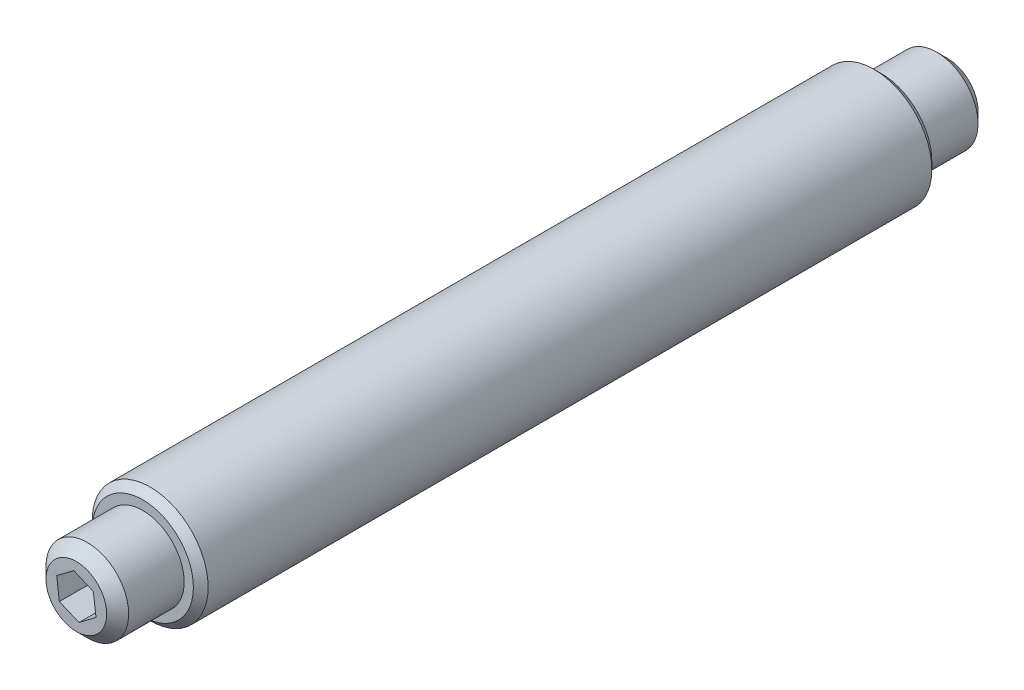
ISO-10303-21;
HEADER;
FILE_DESCRIPTION(('STEP AP214'),'2;1');
FILE_NAME('part.step','',(''),(''),'','','');
FILE_SCHEMA(('AUTOMOTIVE_DESIGN { 1 0 10303 214 1 1 1 1 }'));
ENDSEC;
DATA;
#1=APPLICATION_CONTEXT('core data for automotive mechanical design processes');
#2=APPLICATION_PROTOCOL_DEFINITION('international standard','automotive_design',2000,#1);
#3=PRODUCT_CONTEXT('',#1,'mechanical');
#4=PRODUCT('Part','Part','',(#3));
#5=PRODUCT_RELATED_PRODUCT_CATEGORY('part','',(#4));
#6=PRODUCT_DEFINITION_FORMATION('','',#4);
#7=PRODUCT_DEFINITION_CONTEXT('part definition',#1,'design');
#8=PRODUCT_DEFINITION('design','',#6,#7);
#9=PRODUCT_DEFINITION_SHAPE('','',#8);
#10=(LENGTH_UNIT() NAMED_UNIT(*) SI_UNIT(.MILLI.,.METRE.));
#11=(NAMED_UNIT(*) PLANE_ANGLE_UNIT() SI_UNIT($,.RADIAN.));
#12=(NAMED_UNIT(*) SI_UNIT($,.STERADIAN.) SOLID_ANGLE_UNIT());
#13=UNCERTAINTY_MEASURE_WITH_UNIT(LENGTH_MEASURE(1.E-05),#10,'distance_accuracy_value','');
#14=(GEOMETRIC_REPRESENTATION_CONTEXT(3) GLOBAL_UNCERTAINTY_ASSIGNED_CONTEXT((#13)) GLOBAL_UNIT_ASSIGNED_CONTEXT((#10,
#11,#12)) REPRESENTATION_CONTEXT('',''));
#15=CARTESIAN_POINT('',(0.,0.,0.));
#16=DIRECTION('',(0.,0.,1.));
#17=DIRECTION('',(1.,0.,0.));
#18=AXIS2_PLACEMENT_3D('',#15,#16,#17);
#19=CARTESIAN_POINT('',(0.,0.,14.986));
#20=DIRECTION('',(0.,0.,1.));
#21=DIRECTION('',(0.797255009832151,0.603642650330092,0.));
#22=AXIS2_PLACEMENT_3D('',#19,#20,#21);
#23=PLANE('',#22);
#24=CARTESIAN_POINT('',(0.,0.,14.986));
#25=DIRECTION('',(0.,0.,1.));
#26=DIRECTION('',(0.797255009832151,0.603642650330092,0.));
#27=AXIS2_PLACEMENT_3D('',#24,#25,#26);
#28=CIRCLE('',#27,1.04394);
#29=CARTESIAN_POINT('',(0.832286394964176,0.630166708385596,14.986));
#30=VERTEX_POINT('',#29);
#31=EDGE_CURVE('P0_E10',#30,#30,#28,.T.);
#32=ORIENTED_EDGE('',*,*,#31,.T.);
#33=EDGE_LOOP('',(#32));
#34=FACE_BOUND('',#33,.T.);
#35=DIRECTION('',(-0.79725500983215,-0.603642650330092,0.));
#36=VECTOR('',#35,1.);
#37=CARTESIAN_POINT('',(-0.0910255074271106,0.727562842874054,14.986));
#38=LINE('',#37,#36);
#39=CARTESIAN_POINT('',(-0.0910255074271106,0.727562842874054,14.986));
#40=VERTEX_POINT('',#39);
#41=CARTESIAN_POINT('',(-0.67560065849211,0.284951019612783,14.986));
#42=VERTEX_POINT('',#41);
#43=EDGE_CURVE('P0_E77',#40,#42,#38,.T.);
#44=ORIENTED_EDGE('',*,*,#43,.F.);
#45=DIRECTION('',(0.921397374909702,-0.388621766644009,0.));
#46=VECTOR('',#45,1.);
#47=CARTESIAN_POINT('',(-0.0910255074271106,0.727562842874054,14.986));
#48=LINE('',#47,#46);
#49=CARTESIAN_POINT('',(0.584575151064998,0.442611823261273,14.986));
#50=VERTEX_POINT('',#49);
#51=EDGE_CURVE('P0_E30',#40,#50,#48,.T.);
#52=ORIENTED_EDGE('',*,*,#51,.T.);
#53=DIRECTION('',(-0.124142365077551,0.992264416974101,0.));
#54=VECTOR('',#53,1.);
#55=CARTESIAN_POINT('',(0.675600658492106,-0.284951019612777,14.986));
#56=LINE('',#55,#54);
#57=CARTESIAN_POINT('',(0.675600658492106,-0.284951019612777,14.986));
#58=VERTEX_POINT('',#57);
#59=EDGE_CURVE('P0_E83',#58,#50,#56,.T.);
#60=ORIENTED_EDGE('',*,*,#59,.F.);
#61=DIRECTION('',(-0.797255009832151,-0.603642650330092,0.));
#62=VECTOR('',#61,1.);
#63=CARTESIAN_POINT('',(0.675600658492106,-0.284951019612777,14.986));
#64=LINE('',#63,#62);
#65=CARTESIAN_POINT('',(0.0910255074271064,-0.727562842874048,14.986));
#66=VERTEX_POINT('',#65);
#67=EDGE_CURVE('P0_E103',#58,#66,#64,.T.);
#68=ORIENTED_EDGE('',*,*,#67,.T.);
#69=DIRECTION('',(-0.921397374909702,0.388621766644009,0.));
#70=VECTOR('',#69,1.);
#71=CARTESIAN_POINT('',(0.0910255074271064,-0.727562842874048,14.986));
#72=LINE('',#71,#70);
#73=CARTESIAN_POINT('',(-0.584575151065002,-0.442611823261268,14.986));
#74=VERTEX_POINT('',#73);
#75=EDGE_CURVE('P0_E106',#66,#74,#72,.T.);
#76=ORIENTED_EDGE('',*,*,#75,.T.);
#77=DIRECTION('',(0.124142365077551,-0.992264416974101,0.));
#78=VECTOR('',#77,1.);
#79=CARTESIAN_POINT('',(-0.67560065849211,0.284951019612783,14.986));
#80=LINE('',#79,#78);
#81=EDGE_CURVE('P0_E109',#42,#74,#80,.T.);
#82=ORIENTED_EDGE('',*,*,#81,.F.);
#83=EDGE_LOOP('',(#44,#52,#60,#68,#76,#82));
#84=FACE_BOUND('',#83,.T.);
#85=ADVANCED_FACE('P0_F16',(#34,#84),#23,.T.);
#86=CARTESIAN_POINT('',(0.,0.,14.986));
#87=DIRECTION('',(0.,0.,-1.));
#88=DIRECTION('',(-0.797255009832151,-0.603642650330092,0.));
#89=AXIS2_PLACEMENT_3D('',#86,#87,#88);
#90=CONICAL_SURFACE('',#89,1.04394,0.785398163397426);
#91=CARTESIAN_POINT('',(0.,0.,14.60754));
#92=DIRECTION('',(0.,0.,1.));
#93=DIRECTION('',(0.797255009832151,0.603642650330092,0.));
#94=AXIS2_PLACEMENT_3D('',#91,#92,#93);
#95=CIRCLE('',#94,1.4224);
#96=CARTESIAN_POINT('',(1.13401552598525,0.858621305829522,14.60754));
#97=VERTEX_POINT('',#96);
#98=EDGE_CURVE('P0_E23',#97,#97,#95,.T.);
#99=ORIENTED_EDGE('',*,*,#98,.T.);
#100=EDGE_LOOP('',(#99));
#101=FACE_BOUND('',#100,.T.);
#102=ORIENTED_EDGE('',*,*,#31,.F.);
#103=EDGE_LOOP('',(#102));
#104=FACE_BOUND('',#103,.T.);
#105=ADVANCED_FACE('P0_F129',(#101,#104),#90,.T.);
#106=CARTESIAN_POINT('',(0.,0.,27.686));
#107=DIRECTION('',(0.,0.,1.));
#108=DIRECTION('',(0.797255009832151,0.603642650330092,0.));
#109=AXIS2_PLACEMENT_3D('',#106,#107,#108);
#110=CYLINDRICAL_SURFACE('',#109,1.4224);
#111=CARTESIAN_POINT('',(0.,0.,9.28369999999999));
#112=DIRECTION('',(0.,0.,1.));
#113=DIRECTION('',(0.797255009832151,0.603642650330092,0.));
#114=AXIS2_PLACEMENT_3D('',#111,#112,#113);
#115=CIRCLE('',#114,1.4224);
#116=CARTESIAN_POINT('',(1.13401552598525,0.858621305829522,9.28369999999999));
#117=VERTEX_POINT('',#116);
#118=EDGE_CURVE('P0_E124',#117,#117,#115,.T.);
#119=ORIENTED_EDGE('',*,*,#118,.T.);
#120=EDGE_LOOP('',(#119));
#121=FACE_BOUND('',#120,.T.);
#122=ORIENTED_EDGE('',*,*,#98,.F.);
#123=EDGE_LOOP('',(#122));
#124=FACE_BOUND('',#123,.T.);
#125=ADVANCED_FACE('P0_F132',(#121,#124),#110,.T.);
#126=CARTESIAN_POINT('',(0.,0.,9.28369999999999));
#127=DIRECTION('',(0.,0.,1.));
#128=DIRECTION('',(0.797255009832151,0.603642650330092,0.));
#129=AXIS2_PLACEMENT_3D('',#126,#127,#128);
#130=CONICAL_SURFACE('',#129,1.4224,0.785398163397453);
#131=CARTESIAN_POINT('',(0.,0.,8.636));
#132=DIRECTION('',(0.,0.,1.));
#133=DIRECTION('',(0.797255009832151,0.603642650330092,0.));
#134=AXIS2_PLACEMENT_3D('',#131,#132,#133);
#135=CIRCLE('',#134,0.7747);
#136=CARTESIAN_POINT('',(0.617633456116967,0.467641961210721,8.636));
#137=VERTEX_POINT('',#136);
#138=EDGE_CURVE('P0_E84',#137,#137,#135,.T.);
#139=ORIENTED_EDGE('',*,*,#138,.T.);
#140=EDGE_LOOP('',(#139));
#141=FACE_BOUND('',#140,.T.);
#142=ORIENTED_EDGE('',*,*,#118,.F.);
#143=EDGE_LOOP('',(#142));
#144=FACE_BOUND('',#143,.T.);
#145=ADVANCED_FACE('P0_F134',(#141,#144),#130,.T.);
#146=CARTESIAN_POINT('',(0.,0.,9.10148672156064));
#147=DIRECTION('',(0.,0.,-1.));
#148=DIRECTION('',(-0.797255009832151,-0.603642650330092,0.));
#149=AXIS2_PLACEMENT_3D('',#146,#147,#148);
#150=CONICAL_SURFACE('',#149,0.,1.02974425867666);
#151=ORIENTED_EDGE('',*,*,#138,.F.);
#152=EDGE_LOOP('',(#151));
#153=FACE_BOUND('',#152,.T.);
#154=CARTESIAN_POINT('',(0.,0.,9.10148672156064));
#155=VERTEX_POINT('',#154);
#156=VERTEX_LOOP('',#155);
#157=FACE_BOUND('',#156,.T.);
#158=ADVANCED_FACE('P0_F142',(#153,#157),#150,.F.);
#159=CARTESIAN_POINT('',(-0.0910255074271106,0.727562842874053,13.208));
#160=DIRECTION('',(-0.388621766644009,-0.921397374909702,0.));
#161=DIRECTION('',(-0.921397374909702,0.388621766644009,0.));
#162=AXIS2_PLACEMENT_3D('',#159,#160,#161);
#163=PLANE('',#162);
#164=ORIENTED_EDGE('',*,*,#51,.F.);
#165=DIRECTION('',(0.,0.,1.));
#166=VECTOR('',#165,1.);
#167=CARTESIAN_POINT('',(-0.0910255074271106,0.727562842874053,13.208));
#168=LINE('',#167,#166);
#169=CARTESIAN_POINT('',(-0.0910255074271106,0.727562842874053,13.208));
#170=VERTEX_POINT('',#169);
#171=EDGE_CURVE('P0_E71',#170,#40,#168,.T.);
#172=ORIENTED_EDGE('',*,*,#171,.F.);
#173=DIRECTION('',(0.921397374909702,-0.388621766644009,0.));
#174=VECTOR('',#173,1.);
#175=CARTESIAN_POINT('',(-0.0910255074271106,0.727562842874053,13.208));
#176=LINE('',#175,#174);
#177=CARTESIAN_POINT('',(0.584575151064998,0.442611823261273,13.208));
#178=VERTEX_POINT('',#177);
#179=EDGE_CURVE('P0_E66',#170,#178,#176,.T.);
#180=ORIENTED_EDGE('',*,*,#179,.T.);
#181=DIRECTION('',(0.,0.,1.));
#182=VECTOR('',#181,1.);
#183=CARTESIAN_POINT('',(0.584575151064998,0.442611823261273,13.208));
#184=LINE('',#183,#182);
#185=EDGE_CURVE('P0_E69',#178,#50,#184,.T.);
#186=ORIENTED_EDGE('',*,*,#185,.T.);
#187=EDGE_LOOP('',(#164,#172,#180,#186));
#188=FACE_BOUND('',#187,.T.);
#189=ADVANCED_FACE('P0_F68',(#188),#163,.T.);
#190=CARTESIAN_POINT('',(0.675600658492106,-0.284951019612778,13.208));
#191=DIRECTION('',(0.992264416974101,0.124142365077551,0.));
#192=DIRECTION('',(0.124142365077551,-0.992264416974101,0.));
#193=AXIS2_PLACEMENT_3D('',#190,#191,#192);
#194=PLANE('',#193);
#195=ORIENTED_EDGE('',*,*,#59,.T.);
#196=ORIENTED_EDGE('',*,*,#185,.F.);
#197=DIRECTION('',(-0.124142365077551,0.992264416974101,0.));
#198=VECTOR('',#197,1.);
#199=CARTESIAN_POINT('',(0.675600658492106,-0.284951019612778,13.208));
#200=LINE('',#199,#198);
#201=CARTESIAN_POINT('',(0.675600658492106,-0.284951019612778,13.208));
#202=VERTEX_POINT('',#201);
#203=EDGE_CURVE('P0_E76',#202,#178,#200,.T.);
#204=ORIENTED_EDGE('',*,*,#203,.F.);
#205=DIRECTION('',(0.,0.,1.));
#206=VECTOR('',#205,1.);
#207=CARTESIAN_POINT('',(0.675600658492106,-0.284951019612778,13.208));
#208=LINE('',#207,#206);
#209=EDGE_CURVE('P0_E85',#202,#58,#208,.T.);
#210=ORIENTED_EDGE('',*,*,#209,.T.);
#211=EDGE_LOOP('',(#195,#196,#204,#210));
#212=FACE_BOUND('',#211,.T.);
#213=ADVANCED_FACE('P0_F81',(#212),#194,.F.);
#214=CARTESIAN_POINT('',(0.675600658492106,-0.284951019612778,13.208));
#215=DIRECTION('',(-0.603642650330092,0.797255009832151,0.));
#216=DIRECTION('',(0.797255009832151,0.603642650330092,0.));
#217=AXIS2_PLACEMENT_3D('',#214,#215,#216);
#218=PLANE('',#217);
#219=ORIENTED_EDGE('',*,*,#67,.F.);
#220=ORIENTED_EDGE('',*,*,#209,.F.);
#221=DIRECTION('',(-0.797255009832151,-0.603642650330092,0.));
#222=VECTOR('',#221,1.);
#223=CARTESIAN_POINT('',(0.675600658492106,-0.284951019612778,13.208));
#224=LINE('',#223,#222);
#225=CARTESIAN_POINT('',(0.0910255074271064,-0.727562842874048,13.208));
#226=VERTEX_POINT('',#225);
#227=EDGE_CURVE('P0_E90',#202,#226,#224,.T.);
#228=ORIENTED_EDGE('',*,*,#227,.T.);
#229=DIRECTION('',(0.,0.,1.));
#230=VECTOR('',#229,1.);
#231=CARTESIAN_POINT('',(0.0910255074271064,-0.727562842874048,13.208));
#232=LINE('',#231,#230);
#233=EDGE_CURVE('P0_E119',#226,#66,#232,.T.);
#234=ORIENTED_EDGE('',*,*,#233,.T.);
#235=EDGE_LOOP('',(#219,#220,#228,#234));
#236=FACE_BOUND('',#235,.T.);
#237=ADVANCED_FACE('P0_F165',(#236),#218,.T.);
#238=CARTESIAN_POINT('',(0.0910255074271064,-0.727562842874048,13.208));
#239=DIRECTION('',(0.388621766644009,0.921397374909702,0.));
#240=DIRECTION('',(0.921397374909702,-0.388621766644009,0.));
#241=AXIS2_PLACEMENT_3D('',#238,#239,#240);
#242=PLANE('',#241);
#243=ORIENTED_EDGE('',*,*,#75,.F.);
#244=ORIENTED_EDGE('',*,*,#233,.F.);
#245=DIRECTION('',(-0.921397374909702,0.388621766644009,0.));
#246=VECTOR('',#245,1.);
#247=CARTESIAN_POINT('',(0.0910255074271064,-0.727562842874048,13.208));
#248=LINE('',#247,#246);
#249=CARTESIAN_POINT('',(-0.584575151065002,-0.442611823261268,13.208));
#250=VERTEX_POINT('',#249);
#251=EDGE_CURVE('P0_E92',#226,#250,#248,.T.);
#252=ORIENTED_EDGE('',*,*,#251,.T.);
#253=DIRECTION('',(0.,0.,1.));
#254=VECTOR('',#253,1.);
#255=CARTESIAN_POINT('',(-0.584575151065002,-0.442611823261268,13.208));
#256=LINE('',#255,#254);
#257=EDGE_CURVE('P0_E117',#250,#74,#256,.T.);
#258=ORIENTED_EDGE('',*,*,#257,.T.);
#259=EDGE_LOOP('',(#243,#244,#252,#258));
#260=FACE_BOUND('',#259,.T.);
#261=ADVANCED_FACE('P0_F161',(#260),#242,.T.);
#262=CARTESIAN_POINT('',(-0.67560065849211,0.284951019612783,13.208));
#263=DIRECTION('',(-0.992264416974101,-0.124142365077551,0.));
#264=DIRECTION('',(-0.124142365077551,0.992264416974101,0.));
#265=AXIS2_PLACEMENT_3D('',#262,#263,#264);
#266=PLANE('',#265);
#267=ORIENTED_EDGE('',*,*,#81,.T.);
#268=ORIENTED_EDGE('',*,*,#257,.F.);
#269=DIRECTION('',(0.124142365077551,-0.992264416974101,0.));
#270=VECTOR('',#269,1.);
#271=CARTESIAN_POINT('',(-0.67560065849211,0.284951019612783,13.208));
#272=LINE('',#271,#270);
#273=CARTESIAN_POINT('',(-0.67560065849211,0.284951019612783,13.208));
#274=VERTEX_POINT('',#273);
#275=EDGE_CURVE('P0_E96',#274,#250,#272,.T.);
#276=ORIENTED_EDGE('',*,*,#275,.F.);
#277=DIRECTION('',(0.,0.,1.));
#278=VECTOR('',#277,1.);
#279=CARTESIAN_POINT('',(-0.67560065849211,0.284951019612783,13.208));
#280=LINE('',#279,#278);
#281=EDGE_CURVE('P0_E115',#274,#42,#280,.T.);
#282=ORIENTED_EDGE('',*,*,#281,.T.);
#283=EDGE_LOOP('',(#267,#268,#276,#282));
#284=FACE_BOUND('',#283,.T.);
#285=ADVANCED_FACE('P0_F158',(#284),#266,.F.);
#286=CARTESIAN_POINT('',(-0.0910255074271106,0.727562842874053,13.208));
#287=DIRECTION('',(-0.603642650330092,0.79725500983215,0.));
#288=DIRECTION('',(0.79725500983215,0.603642650330092,0.));
#289=AXIS2_PLACEMENT_3D('',#286,#287,#288);
#290=PLANE('',#289);
#291=ORIENTED_EDGE('',*,*,#43,.T.);
#292=ORIENTED_EDGE('',*,*,#281,.F.);
#293=DIRECTION('',(-0.79725500983215,-0.603642650330092,0.));
#294=VECTOR('',#293,1.);
#295=CARTESIAN_POINT('',(-0.0910255074271106,0.727562842874053,13.208));
#296=LINE('',#295,#294);
#297=EDGE_CURVE('P0_E99',#170,#274,#296,.T.);
#298=ORIENTED_EDGE('',*,*,#297,.F.);
#299=ORIENTED_EDGE('',*,*,#171,.T.);
#300=EDGE_LOOP('',(#291,#292,#298,#299));
#301=FACE_BOUND('',#300,.T.);
#302=ADVANCED_FACE('P0_F154',(#301),#290,.F.);
#303=CARTESIAN_POINT('',(0.584575151064998,0.442611823261274,13.208));
#304=DIRECTION('',(0.,0.,1.));
#305=DIRECTION('',(0.797255009832151,0.603642650330092,0.));
#306=AXIS2_PLACEMENT_3D('',#303,#304,#305);
#307=PLANE('',#306);
#308=ORIENTED_EDGE('',*,*,#179,.F.);
#309=ORIENTED_EDGE('',*,*,#297,.T.);
#310=ORIENTED_EDGE('',*,*,#275,.T.);
#311=ORIENTED_EDGE('',*,*,#251,.F.);
#312=ORIENTED_EDGE('',*,*,#227,.F.);
#313=ORIENTED_EDGE('',*,*,#203,.T.);
#314=EDGE_LOOP('',(#308,#309,#310,#311,#312,#313));
#315=FACE_BOUND('',#314,.T.);
#316=ADVANCED_FACE('P0_F88',(#315),#307,.T.);
#317=CLOSED_SHELL('',(#85,#105,#125,#145,#158,#189,#213,#237,#261,#285,#302,#316));
#318=MANIFOLD_SOLID_BREP('P0_B1',#317);
#319=CARTESIAN_POINT('',(0.,0.,12.7));
#320=DIRECTION('',(0.,0.,-1.));
#321=DIRECTION('',(-1.,0.,0.));
#322=AXIS2_PLACEMENT_3D('',#319,#320,#321);
#323=CYLINDRICAL_SURFACE('',#322,1.9939);
#324=CARTESIAN_POINT('',(0.,0.,12.446));
#325=DIRECTION('',(0.,0.,1.));
#326=DIRECTION('',(1.,0.,0.));
#327=AXIS2_PLACEMENT_3D('',#324,#325,#326);
#328=CIRCLE('',#327,1.9939);
#329=CARTESIAN_POINT('',(1.9939,0.,12.446));
#330=VERTEX_POINT('',#329);
#331=EDGE_CURVE('P1_E11',#330,#330,#328,.F.);
#332=ORIENTED_EDGE('',*,*,#331,.T.);
#333=EDGE_LOOP('',(#332));
#334=FACE_BOUND('',#333,.T.);
#335=CARTESIAN_POINT('',(0.,0.,-12.446));
#336=DIRECTION('',(0.,0.,1.));
#337=DIRECTION('',(1.,0.,0.));
#338=AXIS2_PLACEMENT_3D('',#335,#336,#337);
#339=CIRCLE('',#338,1.9939);
#340=CARTESIAN_POINT('',(1.9939,0.,-12.446));
#341=VERTEX_POINT('',#340);
#342=EDGE_CURVE('P1_E63',#341,#341,#339,.T.);
#343=ORIENTED_EDGE('',*,*,#342,.T.);
#344=EDGE_LOOP('',(#343));
#345=FACE_BOUND('',#344,.T.);
#346=ADVANCED_FACE('P1_F17',(#334,#345),#323,.T.);
#347=CARTESIAN_POINT('',(0.,0.,12.7));
#348=DIRECTION('',(0.,0.,1.));
#349=DIRECTION('',(1.,0.,0.));
#350=AXIS2_PLACEMENT_3D('',#347,#348,#349);
#351=PLANE('',#350);
#352=CARTESIAN_POINT('',(0.,0.,12.7));
#353=DIRECTION('',(0.,0.,1.));
#354=DIRECTION('',(1.,0.,0.));
#355=AXIS2_PLACEMENT_3D('',#352,#353,#354);
#356=CIRCLE('',#355,1.42239999999999);
#357=CARTESIAN_POINT('',(1.42239999999999,0.,12.7));
#358=VERTEX_POINT('',#357);
#359=EDGE_CURVE('P1_E60',#358,#358,#356,.T.);
#360=ORIENTED_EDGE('',*,*,#359,.F.);
#361=EDGE_LOOP('',(#360));
#362=FACE_BOUND('',#361,.T.);
#363=CARTESIAN_POINT('',(0.,0.,12.7));
#364=DIRECTION('',(0.,0.,1.));
#365=DIRECTION('',(1.,0.,0.));
#366=AXIS2_PLACEMENT_3D('',#363,#364,#365);
#367=CIRCLE('',#366,1.7399);
#368=CARTESIAN_POINT('',(1.7399,0.,12.7));
#369=VERTEX_POINT('',#368);
#370=EDGE_CURVE('P1_E25',#369,#369,#367,.T.);
#371=ORIENTED_EDGE('',*,*,#370,.T.);
#372=EDGE_LOOP('',(#371));
#373=FACE_BOUND('',#372,.T.);
#374=ADVANCED_FACE('P1_F71',(#362,#373),#351,.T.);
#375=CARTESIAN_POINT('',(0.,0.,-12.7));
#376=DIRECTION('',(0.,0.,1.));
#377=DIRECTION('',(1.,0.,0.));
#378=AXIS2_PLACEMENT_3D('',#375,#376,#377);
#379=PLANE('',#378);
#380=CARTESIAN_POINT('',(0.,0.,-12.7));
#381=DIRECTION('',(0.,0.,-1.));
#382=DIRECTION('',(-1.,0.,0.));
#383=AXIS2_PLACEMENT_3D('',#380,#381,#382);
#384=CIRCLE('',#383,1.42239999999999);
#385=CARTESIAN_POINT('',(-1.42239999999999,0.,-12.7));
#386=VERTEX_POINT('',#385);
#387=EDGE_CURVE('P1_E48',#386,#386,#384,.T.);
#388=ORIENTED_EDGE('',*,*,#387,.F.);
#389=EDGE_LOOP('',(#388));
#390=FACE_BOUND('',#389,.T.);
#391=CARTESIAN_POINT('',(0.,0.,-12.7));
#392=DIRECTION('',(0.,0.,1.));
#393=DIRECTION('',(1.,0.,0.));
#394=AXIS2_PLACEMENT_3D('',#391,#392,#393);
#395=CIRCLE('',#394,1.73989999999999);
#396=CARTESIAN_POINT('',(1.73989999999999,0.,-12.7));
#397=VERTEX_POINT('',#396);
#398=EDGE_CURVE('P1_E66',#397,#397,#395,.F.);
#399=ORIENTED_EDGE('',*,*,#398,.T.);
#400=EDGE_LOOP('',(#399));
#401=FACE_BOUND('',#400,.T.);
#402=ADVANCED_FACE('P1_F86',(#390,#401),#379,.F.);
#403=CARTESIAN_POINT('',(0.,0.,-12.446));
#404=DIRECTION('',(0.,0.,1.));
#405=DIRECTION('',(1.,0.,0.));
#406=AXIS2_PLACEMENT_3D('',#403,#404,#405);
#407=CONICAL_SURFACE('',#406,1.9939,0.785398163397455);
#408=ORIENTED_EDGE('',*,*,#398,.F.);
#409=EDGE_LOOP('',(#408));
#410=FACE_BOUND('',#409,.T.);
#411=ORIENTED_EDGE('',*,*,#342,.F.);
#412=EDGE_LOOP('',(#411));
#413=FACE_BOUND('',#412,.T.);
#414=ADVANCED_FACE('P1_F75',(#410,#413),#407,.T.);
#415=CARTESIAN_POINT('',(0.,0.,12.7));
#416=DIRECTION('',(0.,0.,-1.));
#417=DIRECTION('',(-1.,0.,0.));
#418=AXIS2_PLACEMENT_3D('',#415,#416,#417);
#419=CONICAL_SURFACE('',#418,1.7399,0.785398163397442);
#420=ORIENTED_EDGE('',*,*,#331,.F.);
#421=EDGE_LOOP('',(#420));
#422=FACE_BOUND('',#421,.T.);
#423=ORIENTED_EDGE('',*,*,#370,.F.);
#424=EDGE_LOOP('',(#423));
#425=FACE_BOUND('',#424,.T.);
#426=ADVANCED_FACE('P1_F19',(#422,#425),#419,.T.);
#427=CARTESIAN_POINT('',(0.,0.,12.7));
#428=DIRECTION('',(0.,0.,1.));
#429=DIRECTION('',(1.,0.,0.));
#430=AXIS2_PLACEMENT_3D('',#427,#428,#429);
#431=CYLINDRICAL_SURFACE('',#430,1.4224);
#432=CARTESIAN_POINT('',(0.,0.,8.636));
#433=DIRECTION('',(0.,0.,1.));
#434=DIRECTION('',(1.,0.,0.));
#435=AXIS2_PLACEMENT_3D('',#432,#433,#434);
#436=CIRCLE('',#435,1.4224);
#437=CARTESIAN_POINT('',(1.4224,0.,8.636));
#438=VERTEX_POINT('',#437);
#439=EDGE_CURVE('P1_E57',#438,#438,#436,.T.);
#440=ORIENTED_EDGE('',*,*,#439,.F.);
#441=EDGE_LOOP('',(#440));
#442=FACE_BOUND('',#441,.T.);
#443=ORIENTED_EDGE('',*,*,#359,.T.);
#444=EDGE_LOOP('',(#443));
#445=FACE_BOUND('',#444,.T.);
#446=ADVANCED_FACE('P1_F74',(#442,#445),#431,.F.);
#447=CARTESIAN_POINT('',(1.1303,0.,8.636));
#448=DIRECTION('',(0.,0.,-1.));
#449=DIRECTION('',(-1.,0.,0.));
#450=AXIS2_PLACEMENT_3D('',#447,#448,#449);
#451=PLANE('',#450);
#452=CARTESIAN_POINT('',(0.,0.,8.636));
#453=DIRECTION('',(0.,0.,1.));
#454=DIRECTION('',(1.,0.,0.));
#455=AXIS2_PLACEMENT_3D('',#452,#453,#454);
#456=CIRCLE('',#455,1.1303);
#457=CARTESIAN_POINT('',(1.1303,0.,8.636));
#458=VERTEX_POINT('',#457);
#459=EDGE_CURVE('P1_E54',#458,#458,#456,.T.);
#460=ORIENTED_EDGE('',*,*,#459,.F.);
#461=EDGE_LOOP('',(#460));
#462=FACE_BOUND('',#461,.T.);
#463=ORIENTED_EDGE('',*,*,#439,.T.);
#464=EDGE_LOOP('',(#463));
#465=FACE_BOUND('',#464,.T.);
#466=ADVANCED_FACE('P1_F83',(#462,#465),#451,.F.);
#467=CARTESIAN_POINT('',(0.,0.,12.7));
#468=DIRECTION('',(0.,0.,1.));
#469=DIRECTION('',(1.,0.,0.));
#470=AXIS2_PLACEMENT_3D('',#467,#468,#469);
#471=CYLINDRICAL_SURFACE('',#470,1.1303);
#472=CARTESIAN_POINT('',(0.,0.,7.62));
#473=DIRECTION('',(0.,0.,1.));
#474=DIRECTION('',(1.,0.,0.));
#475=AXIS2_PLACEMENT_3D('',#472,#473,#474);
#476=CIRCLE('',#475,1.1303);
#477=CARTESIAN_POINT('',(1.1303,0.,7.62));
#478=VERTEX_POINT('',#477);
#479=EDGE_CURVE('P1_E51',#478,#478,#476,.T.);
#480=ORIENTED_EDGE('',*,*,#479,.F.);
#481=EDGE_LOOP('',(#480));
#482=FACE_BOUND('',#481,.T.);
#483=ORIENTED_EDGE('',*,*,#459,.T.);
#484=EDGE_LOOP('',(#483));
#485=FACE_BOUND('',#484,.T.);
#486=ADVANCED_FACE('P1_F105',(#482,#485),#471,.F.);
#487=CARTESIAN_POINT('',(0.,0.,7.62));
#488=DIRECTION('',(0.,0.,1.));
#489=DIRECTION('',(1.,0.,0.));
#490=AXIS2_PLACEMENT_3D('',#487,#488,#489);
#491=CONICAL_SURFACE('',#490,1.1303,1.02974425867665);
#492=CARTESIAN_POINT('',(0.,0.,6.94084724231315));
#493=VERTEX_POINT('',#492);
#494=VERTEX_LOOP('',#493);
#495=FACE_BOUND('',#494,.T.);
#496=ORIENTED_EDGE('',*,*,#479,.T.);
#497=EDGE_LOOP('',(#496));
#498=FACE_BOUND('',#497,.T.);
#499=ADVANCED_FACE('P1_F109',(#495,#498),#491,.F.);
#500=CARTESIAN_POINT('',(0.,0.,-12.7));
#501=DIRECTION('',(0.,0.,-1.));
#502=DIRECTION('',(-1.,0.,0.));
#503=AXIS2_PLACEMENT_3D('',#500,#501,#502);
#504=CYLINDRICAL_SURFACE('',#503,1.4224);
#505=CARTESIAN_POINT('',(0.,0.,-8.636));
#506=DIRECTION('',(0.,0.,-1.));
#507=DIRECTION('',(-1.,0.,0.));
#508=AXIS2_PLACEMENT_3D('',#505,#506,#507);
#509=CIRCLE('',#508,1.4224);
#510=CARTESIAN_POINT('',(-1.4224,0.,-8.636));
#511=VERTEX_POINT('',#510);
#512=EDGE_CURVE('P1_E43',#511,#511,#509,.T.);
#513=ORIENTED_EDGE('',*,*,#512,.F.);
#514=EDGE_LOOP('',(#513));
#515=FACE_BOUND('',#514,.T.);
#516=ORIENTED_EDGE('',*,*,#387,.T.);
#517=EDGE_LOOP('',(#516));
#518=FACE_BOUND('',#517,.T.);
#519=ADVANCED_FACE('P1_F113',(#515,#518),#504,.F.);
#520=CARTESIAN_POINT('',(1.1303,0.,-8.636));
#521=DIRECTION('',(0.,0.,1.));
#522=DIRECTION('',(1.,0.,0.));
#523=AXIS2_PLACEMENT_3D('',#520,#521,#522);
#524=PLANE('',#523);
#525=CARTESIAN_POINT('',(0.,0.,-8.636));
#526=DIRECTION('',(0.,0.,-1.));
#527=DIRECTION('',(-1.,0.,0.));
#528=AXIS2_PLACEMENT_3D('',#525,#526,#527);
#529=CIRCLE('',#528,1.1303);
#530=CARTESIAN_POINT('',(-1.1303,0.,-8.636));
#531=VERTEX_POINT('',#530);
#532=EDGE_CURVE('P1_E40',#531,#531,#529,.T.);
#533=ORIENTED_EDGE('',*,*,#532,.F.);
#534=EDGE_LOOP('',(#533));
#535=FACE_BOUND('',#534,.T.);
#536=ORIENTED_EDGE('',*,*,#512,.T.);
#537=EDGE_LOOP('',(#536));
#538=FACE_BOUND('',#537,.T.);
#539=ADVANCED_FACE('P1_F116',(#535,#538),#524,.F.);
#540=CARTESIAN_POINT('',(0.,0.,-12.7));
#541=DIRECTION('',(0.,0.,-1.));
#542=DIRECTION('',(-1.,0.,0.));
#543=AXIS2_PLACEMENT_3D('',#540,#541,#542);
#544=CYLINDRICAL_SURFACE('',#543,1.1303);
#545=CARTESIAN_POINT('',(0.,0.,-7.62));
#546=DIRECTION('',(0.,0.,-1.));
#547=DIRECTION('',(-1.,0.,0.));
#548=AXIS2_PLACEMENT_3D('',#545,#546,#547);
#549=CIRCLE('',#548,1.1303);
#550=CARTESIAN_POINT('',(-1.1303,0.,-7.62));
#551=VERTEX_POINT('',#550);
#552=EDGE_CURVE('P1_E38',#551,#551,#549,.T.);
#553=ORIENTED_EDGE('',*,*,#552,.F.);
#554=EDGE_LOOP('',(#553));
#555=FACE_BOUND('',#554,.T.);
#556=ORIENTED_EDGE('',*,*,#532,.T.);
#557=EDGE_LOOP('',(#556));
#558=FACE_BOUND('',#557,.T.);
#559=ADVANCED_FACE('P1_F34',(#555,#558),#544,.F.);
#560=CARTESIAN_POINT('',(0.,0.,-7.62));
#561=DIRECTION('',(0.,0.,-1.));
#562=DIRECTION('',(-1.,0.,0.));
#563=AXIS2_PLACEMENT_3D('',#560,#561,#562);
#564=CONICAL_SURFACE('',#563,1.1303,1.02974425867665);
#565=CARTESIAN_POINT('',(0.,0.,-6.94084724231315));
#566=VERTEX_POINT('',#565);
#567=VERTEX_LOOP('',#566);
#568=FACE_BOUND('',#567,.T.);
#569=ORIENTED_EDGE('',*,*,#552,.T.);
#570=EDGE_LOOP('',(#569));
#571=FACE_BOUND('',#570,.T.);
#572=ADVANCED_FACE('P1_F31',(#568,#571),#564,.F.);
#573=CLOSED_SHELL('',(#346,#374,#402,#414,#426,#446,#466,#486,#499,#519,#539,#559,#572));
#574=MANIFOLD_SOLID_BREP('P1_B1',#573);
#575=CARTESIAN_POINT('',(0.,0.,-14.986));
#576=DIRECTION('',(0.,0.,-1.));
#577=DIRECTION('',(-0.999565809389705,-0.0294651098607339,0.));
#578=AXIS2_PLACEMENT_3D('',#575,#576,#577);
#579=PLANE('',#578);
#580=CARTESIAN_POINT('',(0.,0.,-14.986));
#581=DIRECTION('',(0.,0.,-1.));
#582=DIRECTION('',(-0.999565809389705,-0.0294651098607339,0.));
#583=AXIS2_PLACEMENT_3D('',#580,#581,#582);
#584=CIRCLE('',#583,1.04394);
#585=CARTESIAN_POINT('',(-1.04348673105429,-0.0307598067880144,-14.986));
#586=VERTEX_POINT('',#585);
#587=EDGE_CURVE('P2_E11',#586,#586,#584,.T.);
#588=ORIENTED_EDGE('',*,*,#587,.T.);
#589=EDGE_LOOP('',(#588));
#590=FACE_BOUND('',#589,.T.);
#591=DIRECTION('',(0.999565809389705,0.0294651098607337,0.));
#592=VECTOR('',#591,1.);
#593=CARTESIAN_POINT('',(-0.385168583855238,0.623921866377746,-14.986));
#594=LINE('',#593,#592);
#595=CARTESIAN_POINT('',(-0.385168583855238,0.623921866377746,-14.986));
#596=VERTEX_POINT('',#595);
#597=CARTESIAN_POINT('',(0.347747894332105,0.645526711547187,-14.986));
#598=VERTEX_POINT('',#597);
#599=EDGE_CURVE('P2_E78',#596,#598,#594,.T.);
#600=ORIENTED_EDGE('',*,*,#599,.F.);
#601=DIRECTION('',(-0.474265371030158,-0.880381938616205,0.));
#602=VECTOR('',#601,1.);
#603=CARTESIAN_POINT('',(-0.385168583855238,0.623921866377746,-14.986));
#604=LINE('',#603,#602);
#605=CARTESIAN_POINT('',(-0.732916478187344,-0.0216048451694372,-14.986));
#606=VERTEX_POINT('',#605);
#607=EDGE_CURVE('P2_E31',#596,#606,#604,.T.);
#608=ORIENTED_EDGE('',*,*,#607,.T.);
#609=DIRECTION('',(-0.525300438359547,0.850916828755471,0.));
#610=VECTOR('',#609,1.);
#611=CARTESIAN_POINT('',(-0.347747894332106,-0.645526711547179,-14.986));
#612=LINE('',#611,#610);
#613=CARTESIAN_POINT('',(-0.347747894332106,-0.645526711547179,-14.986));
#614=VERTEX_POINT('',#613);
#615=EDGE_CURVE('P2_E84',#614,#606,#612,.T.);
#616=ORIENTED_EDGE('',*,*,#615,.F.);
#617=DIRECTION('',(0.999565809389705,0.0294651098607339,0.));
#618=VECTOR('',#617,1.);
#619=CARTESIAN_POINT('',(-0.347747894332106,-0.645526711547179,-14.986));
#620=LINE('',#619,#618);
#621=CARTESIAN_POINT('',(0.385168583855237,-0.623921866377737,-14.986));
#622=VERTEX_POINT('',#621);
#623=EDGE_CURVE('P2_E104',#614,#622,#620,.T.);
#624=ORIENTED_EDGE('',*,*,#623,.T.);
#625=DIRECTION('',(0.474265371030158,0.880381938616205,0.));
#626=VECTOR('',#625,1.);
#627=CARTESIAN_POINT('',(0.385168583855237,-0.623921866377737,-14.986));
#628=LINE('',#627,#626);
#629=CARTESIAN_POINT('',(0.732916478187342,0.021604845169446,-14.986));
#630=VERTEX_POINT('',#629);
#631=EDGE_CURVE('P2_E107',#622,#630,#628,.T.);
#632=ORIENTED_EDGE('',*,*,#631,.T.);
#633=DIRECTION('',(0.525300438359547,-0.850916828755471,0.));
#634=VECTOR('',#633,1.);
#635=CARTESIAN_POINT('',(0.347747894332105,0.645526711547187,-14.986));
#636=LINE('',#635,#634);
#637=EDGE_CURVE('P2_E110',#598,#630,#636,.T.);
#638=ORIENTED_EDGE('',*,*,#637,.F.);
#639=EDGE_LOOP('',(#600,#608,#616,#624,#632,#638));
#640=FACE_BOUND('',#639,.T.);
#641=ADVANCED_FACE('P2_F17',(#590,#640),#579,.T.);
#642=CARTESIAN_POINT('',(0.,0.,-14.986));
#643=DIRECTION('',(0.,0.,1.));
#644=DIRECTION('',(0.999565809389705,0.0294651098607339,0.));
#645=AXIS2_PLACEMENT_3D('',#642,#643,#644);
#646=CONICAL_SURFACE('',#645,1.04394,0.785398163397426);
#647=CARTESIAN_POINT('',(0.,0.,-14.60754));
#648=DIRECTION('',(0.,0.,-1.));
#649=DIRECTION('',(-0.999565809389705,-0.0294651098607339,0.));
#650=AXIS2_PLACEMENT_3D('',#647,#648,#649);
#651=CIRCLE('',#650,1.4224);
#652=CARTESIAN_POINT('',(-1.42178240727592,-0.0419111722659078,-14.60754));
#653=VERTEX_POINT('',#652);
#654=EDGE_CURVE('P2_E24',#653,#653,#651,.T.);
#655=ORIENTED_EDGE('',*,*,#654,.T.);
#656=EDGE_LOOP('',(#655));
#657=FACE_BOUND('',#656,.T.);
#658=ORIENTED_EDGE('',*,*,#587,.F.);
#659=EDGE_LOOP('',(#658));
#660=FACE_BOUND('',#659,.T.);
#661=ADVANCED_FACE('P2_F130',(#657,#660),#646,.T.);
#662=CARTESIAN_POINT('',(0.,0.,-27.686));
#663=DIRECTION('',(0.,0.,-1.));
#664=DIRECTION('',(-0.999565809389705,-0.0294651098607339,0.));
#665=AXIS2_PLACEMENT_3D('',#662,#663,#664);
#666=CYLINDRICAL_SURFACE('',#665,1.4224);
#667=CARTESIAN_POINT('',(0.,0.,-9.28369999999999));
#668=DIRECTION('',(0.,0.,-1.));
#669=DIRECTION('',(-0.999565809389705,-0.0294651098607339,0.));
#670=AXIS2_PLACEMENT_3D('',#667,#668,#669);
#671=CIRCLE('',#670,1.4224);
#672=CARTESIAN_POINT('',(-1.42178240727592,-0.0419111722659077,-9.28369999999999));
#673=VERTEX_POINT('',#672);
#674=EDGE_CURVE('P2_E125',#673,#673,#671,.T.);
#675=ORIENTED_EDGE('',*,*,#674,.T.);
#676=EDGE_LOOP('',(#675));
#677=FACE_BOUND('',#676,.T.);
#678=ORIENTED_EDGE('',*,*,#654,.F.);
#679=EDGE_LOOP('',(#678));
#680=FACE_BOUND('',#679,.T.);
#681=ADVANCED_FACE('P2_F133',(#677,#680),#666,.T.);
#682=CARTESIAN_POINT('',(0.,0.,-9.28369999999999));
#683=DIRECTION('',(0.,0.,-1.));
#684=DIRECTION('',(-0.999565809389705,-0.0294651098607339,0.));
#685=AXIS2_PLACEMENT_3D('',#682,#683,#684);
#686=CONICAL_SURFACE('',#685,1.4224,0.785398163397453);
#687=CARTESIAN_POINT('',(0.,0.,-8.636));
#688=DIRECTION('',(0.,0.,-1.));
#689=DIRECTION('',(-0.999565809389705,-0.0294651098607339,0.));
#690=AXIS2_PLACEMENT_3D('',#687,#688,#689);
#691=CIRCLE('',#690,0.7747);
#692=CARTESIAN_POINT('',(-0.774363632534204,-0.0228266206091104,-8.636));
#693=VERTEX_POINT('',#692);
#694=EDGE_CURVE('P2_E85',#693,#693,#691,.T.);
#695=ORIENTED_EDGE('',*,*,#694,.T.);
#696=EDGE_LOOP('',(#695));
#697=FACE_BOUND('',#696,.T.);
#698=ORIENTED_EDGE('',*,*,#674,.F.);
#699=EDGE_LOOP('',(#698));
#700=FACE_BOUND('',#699,.T.);
#701=ADVANCED_FACE('P2_F135',(#697,#700),#686,.T.);
#702=CARTESIAN_POINT('',(0.,0.,-9.10148672156064));
#703=DIRECTION('',(0.,0.,1.));
#704=DIRECTION('',(0.999565809389705,0.0294651098607339,0.));
#705=AXIS2_PLACEMENT_3D('',#702,#703,#704);
#706=CONICAL_SURFACE('',#705,0.,1.02974425867666);
#707=ORIENTED_EDGE('',*,*,#694,.F.);
#708=EDGE_LOOP('',(#707));
#709=FACE_BOUND('',#708,.T.);
#710=CARTESIAN_POINT('',(0.,0.,-9.10148672156064));
#711=VERTEX_POINT('',#710);
#712=VERTEX_LOOP('',#711);
#713=FACE_BOUND('',#712,.T.);
#714=ADVANCED_FACE('P2_F143',(#709,#713),#706,.F.);
#715=CARTESIAN_POINT('',(-0.385168583855238,0.623921866377746,-13.208));
#716=DIRECTION('',(0.880381938616205,-0.474265371030158,0.));
#717=DIRECTION('',(0.474265371030158,0.880381938616205,0.));
#718=AXIS2_PLACEMENT_3D('',#715,#716,#717);
#719=PLANE('',#718);
#720=ORIENTED_EDGE('',*,*,#607,.F.);
#721=DIRECTION('',(0.,0.,-1.));
#722=VECTOR('',#721,1.);
#723=CARTESIAN_POINT('',(-0.385168583855238,0.623921866377746,-13.208));
#724=LINE('',#723,#722);
#725=CARTESIAN_POINT('',(-0.385168583855238,0.623921866377746,-13.208));
#726=VERTEX_POINT('',#725);
#727=EDGE_CURVE('P2_E72',#726,#596,#724,.T.);
#728=ORIENTED_EDGE('',*,*,#727,.F.);
#729=DIRECTION('',(-0.474265371030158,-0.880381938616205,0.));
#730=VECTOR('',#729,1.);
#731=CARTESIAN_POINT('',(-0.385168583855238,0.623921866377746,-13.208));
#732=LINE('',#731,#730);
#733=CARTESIAN_POINT('',(-0.732916478187344,-0.0216048451694372,-13.208));
#734=VERTEX_POINT('',#733);
#735=EDGE_CURVE('P2_E67',#726,#734,#732,.T.);
#736=ORIENTED_EDGE('',*,*,#735,.T.);
#737=DIRECTION('',(0.,0.,-1.));
#738=VECTOR('',#737,1.);
#739=CARTESIAN_POINT('',(-0.732916478187344,-0.0216048451694372,-13.208));
#740=LINE('',#739,#738);
#741=EDGE_CURVE('P2_E70',#734,#606,#740,.T.);
#742=ORIENTED_EDGE('',*,*,#741,.T.);
#743=EDGE_LOOP('',(#720,#728,#736,#742));
#744=FACE_BOUND('',#743,.T.);
#745=ADVANCED_FACE('P2_F69',(#744),#719,.T.);
#746=CARTESIAN_POINT('',(-0.347747894332106,-0.645526711547179,-13.208));
#747=DIRECTION('',(-0.850916828755471,-0.525300438359547,0.));
#748=DIRECTION('',(0.525300438359548,-0.850916828755471,0.));
#749=AXIS2_PLACEMENT_3D('',#746,#747,#748);
#750=PLANE('',#749);
#751=ORIENTED_EDGE('',*,*,#615,.T.);
#752=ORIENTED_EDGE('',*,*,#741,.F.);
#753=DIRECTION('',(-0.525300438359547,0.850916828755471,0.));
#754=VECTOR('',#753,1.);
#755=CARTESIAN_POINT('',(-0.347747894332106,-0.645526711547179,-13.208));
#756=LINE('',#755,#754);
#757=CARTESIAN_POINT('',(-0.347747894332106,-0.645526711547179,-13.208));
#758=VERTEX_POINT('',#757);
#759=EDGE_CURVE('P2_E77',#758,#734,#756,.T.);
#760=ORIENTED_EDGE('',*,*,#759,.F.);
#761=DIRECTION('',(0.,0.,-1.));
#762=VECTOR('',#761,1.);
#763=CARTESIAN_POINT('',(-0.347747894332106,-0.645526711547179,-13.208));
#764=LINE('',#763,#762);
#765=EDGE_CURVE('P2_E86',#758,#614,#764,.T.);
#766=ORIENTED_EDGE('',*,*,#765,.T.);
#767=EDGE_LOOP('',(#751,#752,#760,#766));
#768=FACE_BOUND('',#767,.T.);
#769=ADVANCED_FACE('P2_F82',(#768),#750,.F.);
#770=CARTESIAN_POINT('',(-0.347747894332106,-0.645526711547179,-13.208));
#771=DIRECTION('',(-0.0294651098607339,0.999565809389705,0.));
#772=DIRECTION('',(-0.999565809389705,-0.0294651098607339,0.));
#773=AXIS2_PLACEMENT_3D('',#770,#771,#772);
#774=PLANE('',#773);
#775=ORIENTED_EDGE('',*,*,#623,.F.);
#776=ORIENTED_EDGE('',*,*,#765,.F.);
#777=DIRECTION('',(0.999565809389705,0.0294651098607339,0.));
#778=VECTOR('',#777,1.);
#779=CARTESIAN_POINT('',(-0.347747894332106,-0.645526711547179,-13.208));
#780=LINE('',#779,#778);
#781=CARTESIAN_POINT('',(0.385168583855237,-0.623921866377737,-13.208));
#782=VERTEX_POINT('',#781);
#783=EDGE_CURVE('P2_E91',#758,#782,#780,.T.);
#784=ORIENTED_EDGE('',*,*,#783,.T.);
#785=DIRECTION('',(0.,0.,-1.));
#786=VECTOR('',#785,1.);
#787=CARTESIAN_POINT('',(0.385168583855237,-0.623921866377737,-13.208));
#788=LINE('',#787,#786);
#789=EDGE_CURVE('P2_E120',#782,#622,#788,.T.);
#790=ORIENTED_EDGE('',*,*,#789,.T.);
#791=EDGE_LOOP('',(#775,#776,#784,#790));
#792=FACE_BOUND('',#791,.T.);
#793=ADVANCED_FACE('P2_F166',(#792),#774,.T.);
#794=CARTESIAN_POINT('',(0.385168583855237,-0.623921866377737,-13.208));
#795=DIRECTION('',(-0.880381938616205,0.474265371030158,0.));
#796=DIRECTION('',(-0.474265371030158,-0.880381938616205,0.));
#797=AXIS2_PLACEMENT_3D('',#794,#795,#796);
#798=PLANE('',#797);
#799=ORIENTED_EDGE('',*,*,#631,.F.);
#800=ORIENTED_EDGE('',*,*,#789,.F.);
#801=DIRECTION('',(0.474265371030158,0.880381938616205,0.));
#802=VECTOR('',#801,1.);
#803=CARTESIAN_POINT('',(0.385168583855237,-0.623921866377737,-13.208));
#804=LINE('',#803,#802);
#805=CARTESIAN_POINT('',(0.732916478187342,0.021604845169446,-13.208));
#806=VERTEX_POINT('',#805);
#807=EDGE_CURVE('P2_E93',#782,#806,#804,.T.);
#808=ORIENTED_EDGE('',*,*,#807,.T.);
#809=DIRECTION('',(0.,0.,-1.));
#810=VECTOR('',#809,1.);
#811=CARTESIAN_POINT('',(0.732916478187342,0.021604845169446,-13.208));
#812=LINE('',#811,#810);
#813=EDGE_CURVE('P2_E118',#806,#630,#812,.T.);
#814=ORIENTED_EDGE('',*,*,#813,.T.);
#815=EDGE_LOOP('',(#799,#800,#808,#814));
#816=FACE_BOUND('',#815,.T.);
#817=ADVANCED_FACE('P2_F162',(#816),#798,.T.);
#818=CARTESIAN_POINT('',(0.347747894332105,0.645526711547187,-13.208));
#819=DIRECTION('',(0.850916828755471,0.525300438359547,0.));
#820=DIRECTION('',(-0.525300438359547,0.850916828755471,0.));
#821=AXIS2_PLACEMENT_3D('',#818,#819,#820);
#822=PLANE('',#821);
#823=ORIENTED_EDGE('',*,*,#637,.T.);
#824=ORIENTED_EDGE('',*,*,#813,.F.);
#825=DIRECTION('',(0.525300438359547,-0.850916828755471,0.));
#826=VECTOR('',#825,1.);
#827=CARTESIAN_POINT('',(0.347747894332105,0.645526711547187,-13.208));
#828=LINE('',#827,#826);
#829=CARTESIAN_POINT('',(0.347747894332105,0.645526711547187,-13.208));
#830=VERTEX_POINT('',#829);
#831=EDGE_CURVE('P2_E97',#830,#806,#828,.T.);
#832=ORIENTED_EDGE('',*,*,#831,.F.);
#833=DIRECTION('',(0.,0.,-1.));
#834=VECTOR('',#833,1.);
#835=CARTESIAN_POINT('',(0.347747894332105,0.645526711547187,-13.208));
#836=LINE('',#835,#834);
#837=EDGE_CURVE('P2_E116',#830,#598,#836,.T.);
#838=ORIENTED_EDGE('',*,*,#837,.T.);
#839=EDGE_LOOP('',(#823,#824,#832,#838));
#840=FACE_BOUND('',#839,.T.);
#841=ADVANCED_FACE('P2_F159',(#840),#822,.F.);
#842=CARTESIAN_POINT('',(-0.385168583855238,0.623921866377746,-13.208));
#843=DIRECTION('',(-0.0294651098607337,0.999565809389705,0.));
#844=DIRECTION('',(-0.999565809389705,-0.0294651098607337,0.));
#845=AXIS2_PLACEMENT_3D('',#842,#843,#844);
#846=PLANE('',#845);
#847=ORIENTED_EDGE('',*,*,#599,.T.);
#848=ORIENTED_EDGE('',*,*,#837,.F.);
#849=DIRECTION('',(0.999565809389705,0.0294651098607337,0.));
#850=VECTOR('',#849,1.);
#851=CARTESIAN_POINT('',(-0.385168583855238,0.623921866377746,-13.208));
#852=LINE('',#851,#850);
#853=EDGE_CURVE('P2_E100',#726,#830,#852,.T.);
#854=ORIENTED_EDGE('',*,*,#853,.F.);
#855=ORIENTED_EDGE('',*,*,#727,.T.);
#856=EDGE_LOOP('',(#847,#848,#854,#855));
#857=FACE_BOUND('',#856,.T.);
#858=ADVANCED_FACE('P2_F155',(#857),#846,.F.);
#859=CARTESIAN_POINT('',(-0.732916478187344,-0.0216048451694371,-13.208));
#860=DIRECTION('',(0.,0.,-1.));
#861=DIRECTION('',(-0.999565809389705,-0.0294651098607339,0.));
#862=AXIS2_PLACEMENT_3D('',#859,#860,#861);
#863=PLANE('',#862);
#864=ORIENTED_EDGE('',*,*,#735,.F.);
#865=ORIENTED_EDGE('',*,*,#853,.T.);
#866=ORIENTED_EDGE('',*,*,#831,.T.);
#867=ORIENTED_EDGE('',*,*,#807,.F.);
#868=ORIENTED_EDGE('',*,*,#783,.F.);
#869=ORIENTED_EDGE('',*,*,#759,.T.);
#870=EDGE_LOOP('',(#864,#865,#866,#867,#868,#869));
#871=FACE_BOUND('',#870,.T.);
#872=ADVANCED_FACE('P2_F89',(#871),#863,.T.);
#873=CLOSED_SHELL('',(#641,#661,#681,#701,#714,#745,#769,#793,#817,#841,#858,#872));
#874=MANIFOLD_SOLID_BREP('P2_B1',#873);
#875=ADVANCED_BREP_SHAPE_REPRESENTATION('',(#18,#318,#574,#874),#14);
#876=SHAPE_DEFINITION_REPRESENTATION(#9,#875);
ENDSEC;
END-ISO-10303-21;
